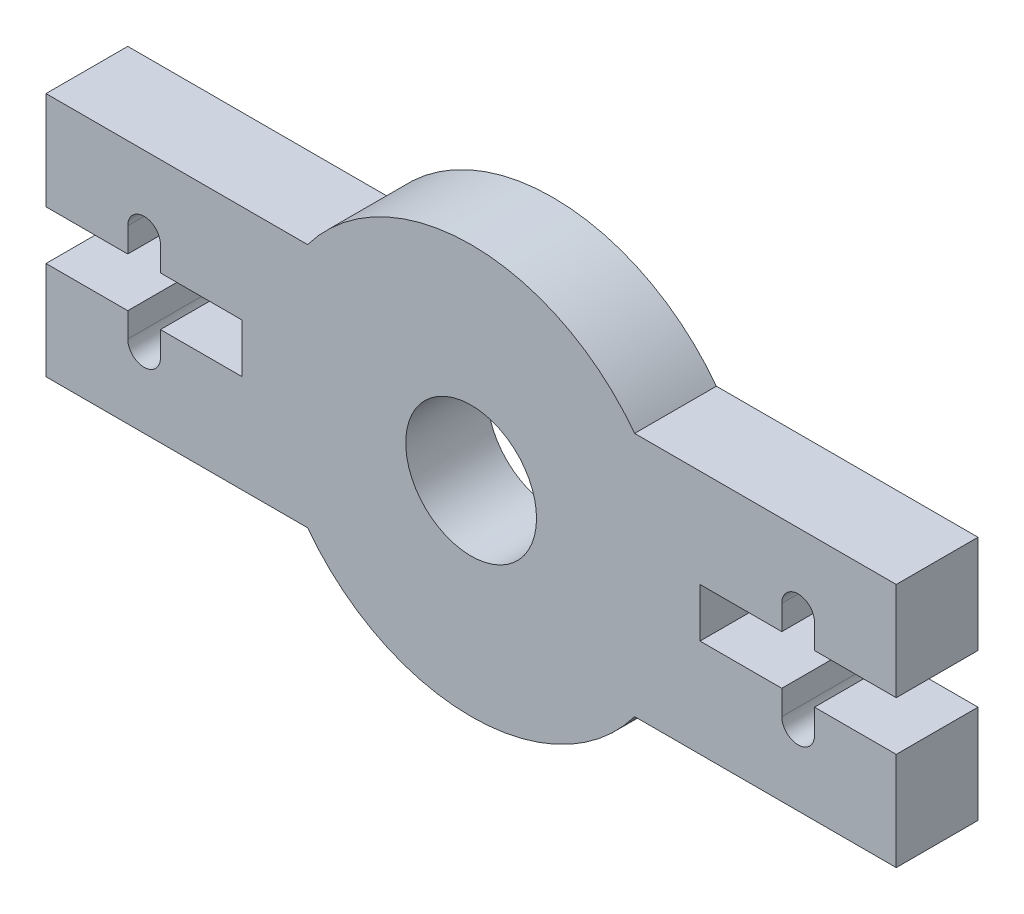
ISO-10303-21;
HEADER;
FILE_DESCRIPTION(('STEP AP214'),'2;1');
FILE_NAME('part.step','',(''),(''),'','','');
FILE_SCHEMA(('AUTOMOTIVE_DESIGN { 1 0 10303 214 1 1 1 1 }'));
ENDSEC;
DATA;
#1=APPLICATION_CONTEXT('core data for automotive mechanical design processes');
#2=APPLICATION_PROTOCOL_DEFINITION('international standard','automotive_design',2000,#1);
#3=PRODUCT_CONTEXT('',#1,'mechanical');
#4=PRODUCT('Part','Part','',(#3));
#5=PRODUCT_RELATED_PRODUCT_CATEGORY('part','',(#4));
#6=PRODUCT_DEFINITION_FORMATION('','',#4);
#7=PRODUCT_DEFINITION_CONTEXT('part definition',#1,'design');
#8=PRODUCT_DEFINITION('design','',#6,#7);
#9=PRODUCT_DEFINITION_SHAPE('','',#8);
#10=(LENGTH_UNIT() NAMED_UNIT(*) SI_UNIT(.MILLI.,.METRE.));
#11=(NAMED_UNIT(*) PLANE_ANGLE_UNIT() SI_UNIT($,.RADIAN.));
#12=(NAMED_UNIT(*) SI_UNIT($,.STERADIAN.) SOLID_ANGLE_UNIT());
#13=UNCERTAINTY_MEASURE_WITH_UNIT(LENGTH_MEASURE(1.E-05),#10,'distance_accuracy_value','');
#14=(GEOMETRIC_REPRESENTATION_CONTEXT(3) GLOBAL_UNCERTAINTY_ASSIGNED_CONTEXT((#13)) GLOBAL_UNIT_ASSIGNED_CONTEXT((#10,
#11,#12)) REPRESENTATION_CONTEXT('',''));
#15=CARTESIAN_POINT('',(0.,0.,0.));
#16=DIRECTION('',(0.,0.,1.));
#17=DIRECTION('',(1.,0.,0.));
#18=AXIS2_PLACEMENT_3D('',#15,#16,#17);
#19=CARTESIAN_POINT('',(0.,7.5,5.));
#20=DIRECTION('',(0.,-1.,0.));
#21=DIRECTION('',(0.,0.,-1.));
#22=AXIS2_PLACEMENT_3D('',#19,#20,#21);
#23=PLANE('',#22);
#24=DIRECTION('',(-1.,0.,0.));
#25=VECTOR('',#24,1.);
#26=CARTESIAN_POINT('',(0.,7.5,0.));
#27=LINE('',#26,#25);
#28=CARTESIAN_POINT('',(26.,7.49999999999999,0.));
#29=VERTEX_POINT('',#28);
#30=CARTESIAN_POINT('',(10.,7.5,0.));
#31=VERTEX_POINT('',#30);
#32=EDGE_CURVE('E341',#29,#31,#27,.T.);
#33=ORIENTED_EDGE('',*,*,#32,.T.);
#34=DIRECTION('',(0.,0.,-1.));
#35=VECTOR('',#34,1.);
#36=CARTESIAN_POINT('',(10.,7.5,5.));
#37=LINE('',#36,#35);
#38=CARTESIAN_POINT('',(10.,7.5,5.));
#39=VERTEX_POINT('',#38);
#40=EDGE_CURVE('E11',#39,#31,#37,.T.);
#41=ORIENTED_EDGE('',*,*,#40,.F.);
#42=DIRECTION('',(-1.,0.,0.));
#43=VECTOR('',#42,1.);
#44=CARTESIAN_POINT('',(0.,7.5,5.));
#45=LINE('',#44,#43);
#46=CARTESIAN_POINT('',(26.,7.49999999999999,5.));
#47=VERTEX_POINT('',#46);
#48=EDGE_CURVE('E334',#47,#39,#45,.T.);
#49=ORIENTED_EDGE('',*,*,#48,.F.);
#50=DIRECTION('',(0.,0.,-1.));
#51=VECTOR('',#50,1.);
#52=CARTESIAN_POINT('',(26.,7.49999999999999,5.));
#53=LINE('',#52,#51);
#54=EDGE_CURVE('E272',#47,#29,#53,.T.);
#55=ORIENTED_EDGE('',*,*,#54,.T.);
#56=EDGE_LOOP('',(#33,#41,#49,#55));
#57=FACE_BOUND('',#56,.T.);
#58=ADVANCED_FACE('F33',(#57),#23,.F.);
#59=CARTESIAN_POINT('',(0.,0.,5.));
#60=DIRECTION('',(0.,0.,-1.));
#61=DIRECTION('',(-1.,0.,0.));
#62=AXIS2_PLACEMENT_3D('',#59,#60,#61);
#63=CYLINDRICAL_SURFACE('',#62,12.5);
#64=CARTESIAN_POINT('',(0.,0.,0.));
#65=DIRECTION('',(0.,0.,1.));
#66=DIRECTION('',(1.,0.,0.));
#67=AXIS2_PLACEMENT_3D('',#64,#65,#66);
#68=CIRCLE('',#67,12.5);
#69=CARTESIAN_POINT('',(-10.,7.5,0.));
#70=VERTEX_POINT('',#69);
#71=EDGE_CURVE('E345',#31,#70,#68,.T.);
#72=ORIENTED_EDGE('',*,*,#71,.T.);
#73=DIRECTION('',(0.,0.,-1.));
#74=VECTOR('',#73,1.);
#75=CARTESIAN_POINT('',(-10.,7.5,5.));
#76=LINE('',#75,#74);
#77=CARTESIAN_POINT('',(-10.,7.5,5.));
#78=VERTEX_POINT('',#77);
#79=EDGE_CURVE('E41',#78,#70,#76,.T.);
#80=ORIENTED_EDGE('',*,*,#79,.F.);
#81=CARTESIAN_POINT('',(0.,0.,5.));
#82=DIRECTION('',(0.,0.,1.));
#83=DIRECTION('',(1.,0.,0.));
#84=AXIS2_PLACEMENT_3D('',#81,#82,#83);
#85=CIRCLE('',#84,12.5);
#86=EDGE_CURVE('E164',#39,#78,#85,.T.);
#87=ORIENTED_EDGE('',*,*,#86,.F.);
#88=ORIENTED_EDGE('',*,*,#40,.T.);
#89=EDGE_LOOP('',(#72,#80,#87,#88));
#90=FACE_BOUND('',#89,.T.);
#91=ADVANCED_FACE('F607',(#90),#63,.T.);
#92=CARTESIAN_POINT('',(0.,7.5,5.));
#93=DIRECTION('',(0.,-1.,0.));
#94=DIRECTION('',(0.,0.,-1.));
#95=AXIS2_PLACEMENT_3D('',#92,#93,#94);
#96=PLANE('',#95);
#97=DIRECTION('',(-1.,0.,0.));
#98=VECTOR('',#97,1.);
#99=CARTESIAN_POINT('',(0.,7.5,0.));
#100=LINE('',#99,#98);
#101=CARTESIAN_POINT('',(-26.,7.5,0.));
#102=VERTEX_POINT('',#101);
#103=EDGE_CURVE('E350',#70,#102,#100,.T.);
#104=ORIENTED_EDGE('',*,*,#103,.T.);
#105=DIRECTION('',(0.,0.,-1.));
#106=VECTOR('',#105,1.);
#107=CARTESIAN_POINT('',(-26.,7.5,5.));
#108=LINE('',#107,#106);
#109=CARTESIAN_POINT('',(-26.,7.5,5.));
#110=VERTEX_POINT('',#109);
#111=EDGE_CURVE('E471',#110,#102,#108,.T.);
#112=ORIENTED_EDGE('',*,*,#111,.F.);
#113=DIRECTION('',(-1.,0.,0.));
#114=VECTOR('',#113,1.);
#115=CARTESIAN_POINT('',(0.,7.5,5.));
#116=LINE('',#115,#114);
#117=EDGE_CURVE('E331',#78,#110,#116,.T.);
#118=ORIENTED_EDGE('',*,*,#117,.F.);
#119=ORIENTED_EDGE('',*,*,#79,.T.);
#120=EDGE_LOOP('',(#104,#112,#118,#119));
#121=FACE_BOUND('',#120,.T.);
#122=ADVANCED_FACE('F476',(#121),#96,.F.);
#123=CARTESIAN_POINT('',(-26.,-42.2370862161727,5.));
#124=DIRECTION('',(-1.,0.,0.));
#125=DIRECTION('',(0.,-1.,0.));
#126=AXIS2_PLACEMENT_3D('',#123,#124,#125);
#127=PLANE('',#126);
#128=DIRECTION('',(0.,1.,0.));
#129=VECTOR('',#128,1.);
#130=CARTESIAN_POINT('',(-26.,-42.2370862161727,0.));
#131=LINE('',#130,#129);
#132=CARTESIAN_POINT('',(-26.,1.5,0.));
#133=VERTEX_POINT('',#132);
#134=EDGE_CURVE('E355',#133,#102,#131,.T.);
#135=ORIENTED_EDGE('',*,*,#134,.F.);
#136=DIRECTION('',(0.,0.,-1.));
#137=VECTOR('',#136,1.);
#138=CARTESIAN_POINT('',(-26.,1.5,5.));
#139=LINE('',#138,#137);
#140=CARTESIAN_POINT('',(-26.,1.5,5.));
#141=VERTEX_POINT('',#140);
#142=EDGE_CURVE('E469',#141,#133,#139,.T.);
#143=ORIENTED_EDGE('',*,*,#142,.F.);
#144=DIRECTION('',(0.,1.,0.));
#145=VECTOR('',#144,1.);
#146=CARTESIAN_POINT('',(-26.,-42.2370862161727,5.));
#147=LINE('',#146,#145);
#148=EDGE_CURVE('E328',#141,#110,#147,.T.);
#149=ORIENTED_EDGE('',*,*,#148,.T.);
#150=ORIENTED_EDGE('',*,*,#111,.T.);
#151=EDGE_LOOP('',(#135,#143,#149,#150));
#152=FACE_BOUND('',#151,.T.);
#153=ADVANCED_FACE('F483',(#152),#127,.T.);
#154=CARTESIAN_POINT('',(0.,1.5,5.));
#155=DIRECTION('',(0.,-1.,0.));
#156=DIRECTION('',(0.,0.,-1.));
#157=AXIS2_PLACEMENT_3D('',#154,#155,#156);
#158=PLANE('',#157);
#159=DIRECTION('',(-1.,0.,0.));
#160=VECTOR('',#159,1.);
#161=CARTESIAN_POINT('',(0.,1.5,0.));
#162=LINE('',#161,#160);
#163=CARTESIAN_POINT('',(-21.,1.5,0.));
#164=VERTEX_POINT('',#163);
#165=EDGE_CURVE('E358',#164,#133,#162,.T.);
#166=ORIENTED_EDGE('',*,*,#165,.F.);
#167=DIRECTION('',(0.,0.,-1.));
#168=VECTOR('',#167,1.);
#169=CARTESIAN_POINT('',(-21.,1.5,5.));
#170=LINE('',#169,#168);
#171=CARTESIAN_POINT('',(-21.,1.5,5.));
#172=VERTEX_POINT('',#171);
#173=EDGE_CURVE('E467',#172,#164,#170,.T.);
#174=ORIENTED_EDGE('',*,*,#173,.F.);
#175=DIRECTION('',(-1.,0.,0.));
#176=VECTOR('',#175,1.);
#177=CARTESIAN_POINT('',(0.,1.5,5.));
#178=LINE('',#177,#176);
#179=EDGE_CURVE('E325',#172,#141,#178,.T.);
#180=ORIENTED_EDGE('',*,*,#179,.T.);
#181=ORIENTED_EDGE('',*,*,#142,.T.);
#182=EDGE_LOOP('',(#166,#174,#180,#181));
#183=FACE_BOUND('',#182,.T.);
#184=ADVANCED_FACE('F488',(#183),#158,.T.);
#185=CARTESIAN_POINT('',(-21.,-42.2370862161727,5.));
#186=DIRECTION('',(1.,0.,0.));
#187=DIRECTION('',(0.,0.,-1.));
#188=AXIS2_PLACEMENT_3D('',#185,#186,#187);
#189=PLANE('',#188);
#190=DIRECTION('',(0.,-1.,0.));
#191=VECTOR('',#190,1.);
#192=CARTESIAN_POINT('',(-21.,-42.2370862161727,0.));
#193=LINE('',#192,#191);
#194=CARTESIAN_POINT('',(-21.,3.,0.));
#195=VERTEX_POINT('',#194);
#196=EDGE_CURVE('E362',#195,#164,#193,.T.);
#197=ORIENTED_EDGE('',*,*,#196,.F.);
#198=DIRECTION('',(0.,0.,-1.));
#199=VECTOR('',#198,1.);
#200=CARTESIAN_POINT('',(-21.,3.,5.));
#201=LINE('',#200,#199);
#202=CARTESIAN_POINT('',(-21.,3.,5.));
#203=VERTEX_POINT('',#202);
#204=EDGE_CURVE('E465',#203,#195,#201,.T.);
#205=ORIENTED_EDGE('',*,*,#204,.F.);
#206=DIRECTION('',(0.,-1.,0.));
#207=VECTOR('',#206,1.);
#208=CARTESIAN_POINT('',(-21.,-42.2370862161727,5.));
#209=LINE('',#208,#207);
#210=EDGE_CURVE('E322',#203,#172,#209,.T.);
#211=ORIENTED_EDGE('',*,*,#210,.T.);
#212=ORIENTED_EDGE('',*,*,#173,.T.);
#213=EDGE_LOOP('',(#197,#205,#211,#212));
#214=FACE_BOUND('',#213,.T.);
#215=ADVANCED_FACE('F491',(#214),#189,.T.);
#216=CARTESIAN_POINT('',(-20.,3.,5.));
#217=DIRECTION('',(0.,0.,-1.));
#218=DIRECTION('',(-1.,0.,0.));
#219=AXIS2_PLACEMENT_3D('',#216,#217,#218);
#220=CYLINDRICAL_SURFACE('',#219,1.);
#221=CARTESIAN_POINT('',(-20.,3.,0.));
#222=DIRECTION('',(0.,0.,1.));
#223=DIRECTION('',(1.,0.,0.));
#224=AXIS2_PLACEMENT_3D('',#221,#222,#223);
#225=CIRCLE('',#224,1.);
#226=CARTESIAN_POINT('',(-19.,3.,0.));
#227=VERTEX_POINT('',#226);
#228=EDGE_CURVE('E366',#227,#195,#225,.T.);
#229=ORIENTED_EDGE('',*,*,#228,.F.);
#230=DIRECTION('',(0.,0.,-1.));
#231=VECTOR('',#230,1.);
#232=CARTESIAN_POINT('',(-19.,3.,5.));
#233=LINE('',#232,#231);
#234=CARTESIAN_POINT('',(-19.,3.,5.));
#235=VERTEX_POINT('',#234);
#236=EDGE_CURVE('E463',#235,#227,#233,.T.);
#237=ORIENTED_EDGE('',*,*,#236,.F.);
#238=CARTESIAN_POINT('',(-20.,3.,5.));
#239=DIRECTION('',(0.,0.,1.));
#240=DIRECTION('',(1.,0.,0.));
#241=AXIS2_PLACEMENT_3D('',#238,#239,#240);
#242=CIRCLE('',#241,1.);
#243=EDGE_CURVE('E319',#235,#203,#242,.T.);
#244=ORIENTED_EDGE('',*,*,#243,.T.);
#245=ORIENTED_EDGE('',*,*,#204,.T.);
#246=EDGE_LOOP('',(#229,#237,#244,#245));
#247=FACE_BOUND('',#246,.T.);
#248=ADVANCED_FACE('F495',(#247),#220,.F.);
#249=CARTESIAN_POINT('',(-19.,-42.2370862161727,5.));
#250=DIRECTION('',(1.,0.,0.));
#251=DIRECTION('',(0.,0.,-1.));
#252=AXIS2_PLACEMENT_3D('',#249,#250,#251);
#253=PLANE('',#252);
#254=DIRECTION('',(0.,-1.,0.));
#255=VECTOR('',#254,1.);
#256=CARTESIAN_POINT('',(-19.,-42.2370862161727,0.));
#257=LINE('',#256,#255);
#258=CARTESIAN_POINT('',(-19.,1.5,0.));
#259=VERTEX_POINT('',#258);
#260=EDGE_CURVE('E370',#227,#259,#257,.T.);
#261=ORIENTED_EDGE('',*,*,#260,.T.);
#262=DIRECTION('',(0.,0.,-1.));
#263=VECTOR('',#262,1.);
#264=CARTESIAN_POINT('',(-19.,1.5,5.));
#265=LINE('',#264,#263);
#266=CARTESIAN_POINT('',(-19.,1.5,5.));
#267=VERTEX_POINT('',#266);
#268=EDGE_CURVE('E461',#267,#259,#265,.T.);
#269=ORIENTED_EDGE('',*,*,#268,.F.);
#270=DIRECTION('',(0.,-1.,0.));
#271=VECTOR('',#270,1.);
#272=CARTESIAN_POINT('',(-19.,-42.2370862161727,5.));
#273=LINE('',#272,#271);
#274=EDGE_CURVE('E317',#235,#267,#273,.T.);
#275=ORIENTED_EDGE('',*,*,#274,.F.);
#276=ORIENTED_EDGE('',*,*,#236,.T.);
#277=EDGE_LOOP('',(#261,#269,#275,#276));
#278=FACE_BOUND('',#277,.T.);
#279=ADVANCED_FACE('F500',(#278),#253,.F.);
#280=CARTESIAN_POINT('',(-14.,1.5,0.));
#281=VERTEX_POINT('',#280);
#282=EDGE_CURVE('E363',#281,#259,#162,.T.);
#283=ORIENTED_EDGE('',*,*,#282,.F.);
#284=DIRECTION('',(0.,0.,-1.));
#285=VECTOR('',#284,1.);
#286=CARTESIAN_POINT('',(-14.,1.5,5.));
#287=LINE('',#286,#285);
#288=CARTESIAN_POINT('',(-14.,1.5,5.));
#289=VERTEX_POINT('',#288);
#290=EDGE_CURVE('E459',#289,#281,#287,.T.);
#291=ORIENTED_EDGE('',*,*,#290,.F.);
#292=EDGE_CURVE('E316',#289,#267,#178,.T.);
#293=ORIENTED_EDGE('',*,*,#292,.T.);
#294=ORIENTED_EDGE('',*,*,#268,.T.);
#295=EDGE_LOOP('',(#283,#291,#293,#294));
#296=FACE_BOUND('',#295,.T.);
#297=ADVANCED_FACE('F595',(#296),#158,.T.);
#298=CARTESIAN_POINT('',(-14.,-42.2370862161727,5.));
#299=DIRECTION('',(-1.,0.,0.));
#300=DIRECTION('',(0.,0.,1.));
#301=AXIS2_PLACEMENT_3D('',#298,#299,#300);
#302=PLANE('',#301);
#303=DIRECTION('',(0.,1.,0.));
#304=VECTOR('',#303,1.);
#305=CARTESIAN_POINT('',(-14.,-42.2370862161727,0.));
#306=LINE('',#305,#304);
#307=CARTESIAN_POINT('',(-14.,-1.5,0.));
#308=VERTEX_POINT('',#307);
#309=EDGE_CURVE('E374',#308,#281,#306,.T.);
#310=ORIENTED_EDGE('',*,*,#309,.F.);
#311=DIRECTION('',(0.,0.,-1.));
#312=VECTOR('',#311,1.);
#313=CARTESIAN_POINT('',(-14.,-1.5,5.));
#314=LINE('',#313,#312);
#315=CARTESIAN_POINT('',(-14.,-1.5,5.));
#316=VERTEX_POINT('',#315);
#317=EDGE_CURVE('E457',#316,#308,#314,.T.);
#318=ORIENTED_EDGE('',*,*,#317,.F.);
#319=DIRECTION('',(0.,1.,0.));
#320=VECTOR('',#319,1.);
#321=CARTESIAN_POINT('',(-14.,-42.2370862161727,5.));
#322=LINE('',#321,#320);
#323=EDGE_CURVE('E312',#316,#289,#322,.T.);
#324=ORIENTED_EDGE('',*,*,#323,.T.);
#325=ORIENTED_EDGE('',*,*,#290,.T.);
#326=EDGE_LOOP('',(#310,#318,#324,#325));
#327=FACE_BOUND('',#326,.T.);
#328=ADVANCED_FACE('F507',(#327),#302,.T.);
#329=CARTESIAN_POINT('',(0.,-1.5,5.));
#330=DIRECTION('',(0.,-1.,0.));
#331=DIRECTION('',(1.,0.,0.));
#332=AXIS2_PLACEMENT_3D('',#329,#330,#331);
#333=PLANE('',#332);
#334=DIRECTION('',(-1.,0.,0.));
#335=VECTOR('',#334,1.);
#336=CARTESIAN_POINT('',(0.,-1.5,0.));
#337=LINE('',#336,#335);
#338=CARTESIAN_POINT('',(-19.,-1.5,0.));
#339=VERTEX_POINT('',#338);
#340=EDGE_CURVE('E377',#308,#339,#337,.T.);
#341=ORIENTED_EDGE('',*,*,#340,.T.);
#342=DIRECTION('',(0.,0.,-1.));
#343=VECTOR('',#342,1.);
#344=CARTESIAN_POINT('',(-19.,-1.5,5.));
#345=LINE('',#344,#343);
#346=CARTESIAN_POINT('',(-19.,-1.5,5.));
#347=VERTEX_POINT('',#346);
#348=EDGE_CURVE('E454',#347,#339,#345,.T.);
#349=ORIENTED_EDGE('',*,*,#348,.F.);
#350=DIRECTION('',(-1.,0.,0.));
#351=VECTOR('',#350,1.);
#352=CARTESIAN_POINT('',(0.,-1.5,5.));
#353=LINE('',#352,#351);
#354=EDGE_CURVE('E310',#316,#347,#353,.T.);
#355=ORIENTED_EDGE('',*,*,#354,.F.);
#356=ORIENTED_EDGE('',*,*,#317,.T.);
#357=EDGE_LOOP('',(#341,#349,#355,#356));
#358=FACE_BOUND('',#357,.T.);
#359=ADVANCED_FACE('F513',(#358),#333,.F.);
#360=CARTESIAN_POINT('',(-19.,-3.,0.));
#361=VERTEX_POINT('',#360);
#362=EDGE_CURVE('E373',#339,#361,#257,.T.);
#363=ORIENTED_EDGE('',*,*,#362,.T.);
#364=DIRECTION('',(0.,0.,-1.));
#365=VECTOR('',#364,1.);
#366=CARTESIAN_POINT('',(-19.,-3.,5.));
#367=LINE('',#366,#365);
#368=CARTESIAN_POINT('',(-19.,-3.,5.));
#369=VERTEX_POINT('',#368);
#370=EDGE_CURVE('E452',#369,#361,#367,.T.);
#371=ORIENTED_EDGE('',*,*,#370,.F.);
#372=EDGE_CURVE('E309',#347,#369,#273,.T.);
#373=ORIENTED_EDGE('',*,*,#372,.F.);
#374=ORIENTED_EDGE('',*,*,#348,.T.);
#375=EDGE_LOOP('',(#363,#371,#373,#374));
#376=FACE_BOUND('',#375,.T.);
#377=ADVANCED_FACE('F521',(#376),#253,.F.);
#378=CARTESIAN_POINT('',(-20.,-3.,5.));
#379=DIRECTION('',(0.,0.,-1.));
#380=DIRECTION('',(-1.,0.,0.));
#381=AXIS2_PLACEMENT_3D('',#378,#379,#380);
#382=CYLINDRICAL_SURFACE('',#381,1.);
#383=CARTESIAN_POINT('',(-20.,-3.,0.));
#384=DIRECTION('',(0.,0.,1.));
#385=DIRECTION('',(1.,0.,0.));
#386=AXIS2_PLACEMENT_3D('',#383,#384,#385);
#387=CIRCLE('',#386,1.);
#388=CARTESIAN_POINT('',(-21.,-3.,0.));
#389=VERTEX_POINT('',#388);
#390=EDGE_CURVE('E380',#389,#361,#387,.T.);
#391=ORIENTED_EDGE('',*,*,#390,.F.);
#392=DIRECTION('',(0.,0.,-1.));
#393=VECTOR('',#392,1.);
#394=CARTESIAN_POINT('',(-21.,-3.,5.));
#395=LINE('',#394,#393);
#396=CARTESIAN_POINT('',(-21.,-3.,5.));
#397=VERTEX_POINT('',#396);
#398=EDGE_CURVE('E450',#397,#389,#395,.T.);
#399=ORIENTED_EDGE('',*,*,#398,.F.);
#400=CARTESIAN_POINT('',(-20.,-3.,5.));
#401=DIRECTION('',(0.,0.,1.));
#402=DIRECTION('',(1.,0.,0.));
#403=AXIS2_PLACEMENT_3D('',#400,#401,#402);
#404=CIRCLE('',#403,1.);
#405=EDGE_CURVE('E305',#397,#369,#404,.T.);
#406=ORIENTED_EDGE('',*,*,#405,.T.);
#407=ORIENTED_EDGE('',*,*,#370,.T.);
#408=EDGE_LOOP('',(#391,#399,#406,#407));
#409=FACE_BOUND('',#408,.T.);
#410=ADVANCED_FACE('F525',(#409),#382,.F.);
#411=CARTESIAN_POINT('',(-21.,-1.5,0.));
#412=VERTEX_POINT('',#411);
#413=EDGE_CURVE('E367',#412,#389,#193,.T.);
#414=ORIENTED_EDGE('',*,*,#413,.F.);
#415=DIRECTION('',(0.,0.,-1.));
#416=VECTOR('',#415,1.);
#417=CARTESIAN_POINT('',(-21.,-1.5,5.));
#418=LINE('',#417,#416);
#419=CARTESIAN_POINT('',(-21.,-1.5,5.));
#420=VERTEX_POINT('',#419);
#421=EDGE_CURVE('E448',#420,#412,#418,.T.);
#422=ORIENTED_EDGE('',*,*,#421,.F.);
#423=EDGE_CURVE('E308',#420,#397,#209,.T.);
#424=ORIENTED_EDGE('',*,*,#423,.T.);
#425=ORIENTED_EDGE('',*,*,#398,.T.);
#426=EDGE_LOOP('',(#414,#422,#424,#425));
#427=FACE_BOUND('',#426,.T.);
#428=ADVANCED_FACE('F529',(#427),#189,.T.);
#429=CARTESIAN_POINT('',(-26.,-1.5,0.));
#430=VERTEX_POINT('',#429);
#431=EDGE_CURVE('E379',#412,#430,#337,.T.);
#432=ORIENTED_EDGE('',*,*,#431,.T.);
#433=DIRECTION('',(0.,0.,-1.));
#434=VECTOR('',#433,1.);
#435=CARTESIAN_POINT('',(-26.,-1.5,5.));
#436=LINE('',#435,#434);
#437=CARTESIAN_POINT('',(-26.,-1.5,5.));
#438=VERTEX_POINT('',#437);
#439=EDGE_CURVE('E446',#438,#430,#436,.T.);
#440=ORIENTED_EDGE('',*,*,#439,.F.);
#441=EDGE_CURVE('E313',#420,#438,#353,.T.);
#442=ORIENTED_EDGE('',*,*,#441,.F.);
#443=ORIENTED_EDGE('',*,*,#421,.T.);
#444=EDGE_LOOP('',(#432,#440,#442,#443));
#445=FACE_BOUND('',#444,.T.);
#446=ADVANCED_FACE('F625',(#445),#333,.F.);
#447=CARTESIAN_POINT('',(-26.,-7.5,0.));
#448=VERTEX_POINT('',#447);
#449=EDGE_CURVE('E359',#448,#430,#131,.T.);
#450=ORIENTED_EDGE('',*,*,#449,.F.);
#451=DIRECTION('',(0.,0.,-1.));
#452=VECTOR('',#451,1.);
#453=CARTESIAN_POINT('',(-26.,-7.5,5.));
#454=LINE('',#453,#452);
#455=CARTESIAN_POINT('',(-26.,-7.5,5.));
#456=VERTEX_POINT('',#455);
#457=EDGE_CURVE('E444',#456,#448,#454,.T.);
#458=ORIENTED_EDGE('',*,*,#457,.F.);
#459=EDGE_CURVE('E304',#456,#438,#147,.T.);
#460=ORIENTED_EDGE('',*,*,#459,.T.);
#461=ORIENTED_EDGE('',*,*,#439,.T.);
#462=EDGE_LOOP('',(#450,#458,#460,#461));
#463=FACE_BOUND('',#462,.T.);
#464=ADVANCED_FACE('F536',(#463),#127,.T.);
#465=CARTESIAN_POINT('',(0.,-7.5,5.));
#466=DIRECTION('',(0.,-1.,0.));
#467=DIRECTION('',(0.,0.,-1.));
#468=AXIS2_PLACEMENT_3D('',#465,#466,#467);
#469=PLANE('',#468);
#470=DIRECTION('',(-1.,0.,0.));
#471=VECTOR('',#470,1.);
#472=CARTESIAN_POINT('',(0.,-7.5,0.));
#473=LINE('',#472,#471);
#474=CARTESIAN_POINT('',(-10.,-7.5,0.));
#475=VERTEX_POINT('',#474);
#476=EDGE_CURVE('E383',#475,#448,#473,.T.);
#477=ORIENTED_EDGE('',*,*,#476,.F.);
#478=DIRECTION('',(0.,0.,-1.));
#479=VECTOR('',#478,1.);
#480=CARTESIAN_POINT('',(-10.,-7.5,5.));
#481=LINE('',#480,#479);
#482=CARTESIAN_POINT('',(-10.,-7.5,5.));
#483=VERTEX_POINT('',#482);
#484=EDGE_CURVE('E442',#483,#475,#481,.T.);
#485=ORIENTED_EDGE('',*,*,#484,.F.);
#486=DIRECTION('',(-1.,0.,0.));
#487=VECTOR('',#486,1.);
#488=CARTESIAN_POINT('',(0.,-7.5,5.));
#489=LINE('',#488,#487);
#490=EDGE_CURVE('E301',#483,#456,#489,.T.);
#491=ORIENTED_EDGE('',*,*,#490,.T.);
#492=ORIENTED_EDGE('',*,*,#457,.T.);
#493=EDGE_LOOP('',(#477,#485,#491,#492));
#494=FACE_BOUND('',#493,.T.);
#495=ADVANCED_FACE('F541',(#494),#469,.T.);
#496=CARTESIAN_POINT('',(0.,0.,5.));
#497=DIRECTION('',(0.,0.,-1.));
#498=DIRECTION('',(-1.,0.,0.));
#499=AXIS2_PLACEMENT_3D('',#496,#497,#498);
#500=CYLINDRICAL_SURFACE('',#499,12.5);
#501=CARTESIAN_POINT('',(0.,0.,0.));
#502=DIRECTION('',(0.,0.,1.));
#503=DIRECTION('',(1.,0.,0.));
#504=AXIS2_PLACEMENT_3D('',#501,#502,#503);
#505=CIRCLE('',#504,12.5);
#506=CARTESIAN_POINT('',(10.,-7.5,0.));
#507=VERTEX_POINT('',#506);
#508=EDGE_CURVE('E386',#475,#507,#505,.T.);
#509=ORIENTED_EDGE('',*,*,#508,.T.);
#510=DIRECTION('',(0.,0.,-1.));
#511=VECTOR('',#510,1.);
#512=CARTESIAN_POINT('',(10.,-7.5,5.));
#513=LINE('',#512,#511);
#514=CARTESIAN_POINT('',(10.,-7.5,5.));
#515=VERTEX_POINT('',#514);
#516=EDGE_CURVE('E440',#515,#507,#513,.T.);
#517=ORIENTED_EDGE('',*,*,#516,.F.);
#518=CARTESIAN_POINT('',(0.,0.,5.));
#519=DIRECTION('',(0.,0.,1.));
#520=DIRECTION('',(1.,0.,0.));
#521=AXIS2_PLACEMENT_3D('',#518,#519,#520);
#522=CIRCLE('',#521,12.5);
#523=EDGE_CURVE('E299',#483,#515,#522,.T.);
#524=ORIENTED_EDGE('',*,*,#523,.F.);
#525=ORIENTED_EDGE('',*,*,#484,.T.);
#526=EDGE_LOOP('',(#509,#517,#524,#525));
#527=FACE_BOUND('',#526,.T.);
#528=ADVANCED_FACE('F546',(#527),#500,.T.);
#529=CARTESIAN_POINT('',(0.,-7.5,5.));
#530=DIRECTION('',(0.,-1.,0.));
#531=DIRECTION('',(0.,0.,-1.));
#532=AXIS2_PLACEMENT_3D('',#529,#530,#531);
#533=PLANE('',#532);
#534=DIRECTION('',(-1.,0.,0.));
#535=VECTOR('',#534,1.);
#536=CARTESIAN_POINT('',(0.,-7.5,0.));
#537=LINE('',#536,#535);
#538=CARTESIAN_POINT('',(26.,-7.5,0.));
#539=VERTEX_POINT('',#538);
#540=EDGE_CURVE('E389',#539,#507,#537,.T.);
#541=ORIENTED_EDGE('',*,*,#540,.F.);
#542=DIRECTION('',(0.,0.,-1.));
#543=VECTOR('',#542,1.);
#544=CARTESIAN_POINT('',(26.,-7.5,5.));
#545=LINE('',#544,#543);
#546=CARTESIAN_POINT('',(26.,-7.5,5.));
#547=VERTEX_POINT('',#546);
#548=EDGE_CURVE('E438',#547,#539,#545,.T.);
#549=ORIENTED_EDGE('',*,*,#548,.F.);
#550=DIRECTION('',(-1.,0.,0.));
#551=VECTOR('',#550,1.);
#552=CARTESIAN_POINT('',(0.,-7.5,5.));
#553=LINE('',#552,#551);
#554=EDGE_CURVE('E296',#547,#515,#553,.T.);
#555=ORIENTED_EDGE('',*,*,#554,.T.);
#556=ORIENTED_EDGE('',*,*,#516,.T.);
#557=EDGE_LOOP('',(#541,#549,#555,#556));
#558=FACE_BOUND('',#557,.T.);
#559=ADVANCED_FACE('F553',(#558),#533,.T.);
#560=CARTESIAN_POINT('',(26.,-42.2370862161727,5.));
#561=DIRECTION('',(-1.,0.,0.));
#562=DIRECTION('',(0.,-1.,0.));
#563=AXIS2_PLACEMENT_3D('',#560,#561,#562);
#564=PLANE('',#563);
#565=DIRECTION('',(0.,1.,0.));
#566=VECTOR('',#565,1.);
#567=CARTESIAN_POINT('',(26.,-42.2370862161727,0.));
#568=LINE('',#567,#566);
#569=CARTESIAN_POINT('',(26.,-1.5,0.));
#570=VERTEX_POINT('',#569);
#571=EDGE_CURVE('E392',#539,#570,#568,.T.);
#572=ORIENTED_EDGE('',*,*,#571,.T.);
#573=DIRECTION('',(0.,0.,-1.));
#574=VECTOR('',#573,1.);
#575=CARTESIAN_POINT('',(26.,-1.5,5.));
#576=LINE('',#575,#574);
#577=CARTESIAN_POINT('',(26.,-1.5,5.));
#578=VERTEX_POINT('',#577);
#579=EDGE_CURVE('E436',#578,#570,#576,.T.);
#580=ORIENTED_EDGE('',*,*,#579,.F.);
#581=DIRECTION('',(0.,1.,0.));
#582=VECTOR('',#581,1.);
#583=CARTESIAN_POINT('',(26.,-42.2370862161727,5.));
#584=LINE('',#583,#582);
#585=EDGE_CURVE('E274',#547,#578,#584,.T.);
#586=ORIENTED_EDGE('',*,*,#585,.F.);
#587=ORIENTED_EDGE('',*,*,#548,.T.);
#588=EDGE_LOOP('',(#572,#580,#586,#587));
#589=FACE_BOUND('',#588,.T.);
#590=ADVANCED_FACE('F556',(#589),#564,.F.);
#591=CARTESIAN_POINT('',(0.,-1.5,5.));
#592=DIRECTION('',(0.,1.,0.));
#593=DIRECTION('',(-1.,0.,0.));
#594=AXIS2_PLACEMENT_3D('',#591,#592,#593);
#595=PLANE('',#594);
#596=DIRECTION('',(1.,0.,0.));
#597=VECTOR('',#596,1.);
#598=CARTESIAN_POINT('',(0.,-1.5,0.));
#599=LINE('',#598,#597);
#600=CARTESIAN_POINT('',(21.,-1.5,0.));
#601=VERTEX_POINT('',#600);
#602=EDGE_CURVE('E395',#601,#570,#599,.T.);
#603=ORIENTED_EDGE('',*,*,#602,.F.);
#604=DIRECTION('',(0.,0.,-1.));
#605=VECTOR('',#604,1.);
#606=CARTESIAN_POINT('',(21.,-1.5,5.));
#607=LINE('',#606,#605);
#608=CARTESIAN_POINT('',(21.,-1.5,5.));
#609=VERTEX_POINT('',#608);
#610=EDGE_CURVE('E434',#609,#601,#607,.T.);
#611=ORIENTED_EDGE('',*,*,#610,.F.);
#612=DIRECTION('',(1.,0.,0.));
#613=VECTOR('',#612,1.);
#614=CARTESIAN_POINT('',(0.,-1.5,5.));
#615=LINE('',#614,#613);
#616=EDGE_CURVE('E290',#609,#578,#615,.T.);
#617=ORIENTED_EDGE('',*,*,#616,.T.);
#618=ORIENTED_EDGE('',*,*,#579,.T.);
#619=EDGE_LOOP('',(#603,#611,#617,#618));
#620=FACE_BOUND('',#619,.T.);
#621=ADVANCED_FACE('F559',(#620),#595,.T.);
#622=CARTESIAN_POINT('',(21.,-42.2370862161727,5.));
#623=DIRECTION('',(1.,0.,0.));
#624=DIRECTION('',(0.,0.,-1.));
#625=AXIS2_PLACEMENT_3D('',#622,#623,#624);
#626=PLANE('',#625);
#627=DIRECTION('',(0.,-1.,0.));
#628=VECTOR('',#627,1.);
#629=CARTESIAN_POINT('',(21.,-42.2370862161727,0.));
#630=LINE('',#629,#628);
#631=CARTESIAN_POINT('',(21.,-3.,0.));
#632=VERTEX_POINT('',#631);
#633=EDGE_CURVE('E398',#601,#632,#630,.T.);
#634=ORIENTED_EDGE('',*,*,#633,.T.);
#635=DIRECTION('',(0.,0.,-1.));
#636=VECTOR('',#635,1.);
#637=CARTESIAN_POINT('',(21.,-3.,5.));
#638=LINE('',#637,#636);
#639=CARTESIAN_POINT('',(21.,-3.,5.));
#640=VERTEX_POINT('',#639);
#641=EDGE_CURVE('E431',#640,#632,#638,.T.);
#642=ORIENTED_EDGE('',*,*,#641,.F.);
#643=DIRECTION('',(0.,-1.,0.));
#644=VECTOR('',#643,1.);
#645=CARTESIAN_POINT('',(21.,-42.2370862161727,5.));
#646=LINE('',#645,#644);
#647=EDGE_CURVE('E261',#609,#640,#646,.T.);
#648=ORIENTED_EDGE('',*,*,#647,.F.);
#649=ORIENTED_EDGE('',*,*,#610,.T.);
#650=EDGE_LOOP('',(#634,#642,#648,#649));
#651=FACE_BOUND('',#650,.T.);
#652=ADVANCED_FACE('F566',(#651),#626,.F.);
#653=CARTESIAN_POINT('',(20.,-3.,5.));
#654=DIRECTION('',(0.,0.,-1.));
#655=DIRECTION('',(-1.,0.,0.));
#656=AXIS2_PLACEMENT_3D('',#653,#654,#655);
#657=CYLINDRICAL_SURFACE('',#656,1.);
#658=CARTESIAN_POINT('',(20.,-3.,0.));
#659=DIRECTION('',(0.,0.,1.));
#660=DIRECTION('',(1.,0.,0.));
#661=AXIS2_PLACEMENT_3D('',#658,#659,#660);
#662=CIRCLE('',#661,1.);
#663=CARTESIAN_POINT('',(19.,-3.,0.));
#664=VERTEX_POINT('',#663);
#665=EDGE_CURVE('E401',#632,#664,#662,.F.);
#666=ORIENTED_EDGE('',*,*,#665,.T.);
#667=DIRECTION('',(0.,0.,-1.));
#668=VECTOR('',#667,1.);
#669=CARTESIAN_POINT('',(19.,-3.,5.));
#670=LINE('',#669,#668);
#671=CARTESIAN_POINT('',(19.,-3.,5.));
#672=VERTEX_POINT('',#671);
#673=EDGE_CURVE('E429',#672,#664,#670,.T.);
#674=ORIENTED_EDGE('',*,*,#673,.F.);
#675=CARTESIAN_POINT('',(20.,-3.,5.));
#676=DIRECTION('',(0.,0.,1.));
#677=DIRECTION('',(1.,0.,0.));
#678=AXIS2_PLACEMENT_3D('',#675,#676,#677);
#679=CIRCLE('',#678,1.);
#680=EDGE_CURVE('E293',#640,#672,#679,.F.);
#681=ORIENTED_EDGE('',*,*,#680,.F.);
#682=ORIENTED_EDGE('',*,*,#641,.T.);
#683=EDGE_LOOP('',(#666,#674,#681,#682));
#684=FACE_BOUND('',#683,.T.);
#685=ADVANCED_FACE('F570',(#684),#657,.F.);
#686=CARTESIAN_POINT('',(19.,-42.2370862161727,5.));
#687=DIRECTION('',(1.,0.,0.));
#688=DIRECTION('',(0.,0.,-1.));
#689=AXIS2_PLACEMENT_3D('',#686,#687,#688);
#690=PLANE('',#689);
#691=DIRECTION('',(0.,-1.,0.));
#692=VECTOR('',#691,1.);
#693=CARTESIAN_POINT('',(19.,-42.2370862161727,0.));
#694=LINE('',#693,#692);
#695=CARTESIAN_POINT('',(19.,-1.5,0.));
#696=VERTEX_POINT('',#695);
#697=EDGE_CURVE('E404',#696,#664,#694,.T.);
#698=ORIENTED_EDGE('',*,*,#697,.F.);
#699=DIRECTION('',(0.,0.,-1.));
#700=VECTOR('',#699,1.);
#701=CARTESIAN_POINT('',(19.,-1.5,5.));
#702=LINE('',#701,#700);
#703=CARTESIAN_POINT('',(19.,-1.5,5.));
#704=VERTEX_POINT('',#703);
#705=EDGE_CURVE('E427',#704,#696,#702,.T.);
#706=ORIENTED_EDGE('',*,*,#705,.F.);
#707=DIRECTION('',(0.,-1.,0.));
#708=VECTOR('',#707,1.);
#709=CARTESIAN_POINT('',(19.,-42.2370862161727,5.));
#710=LINE('',#709,#708);
#711=EDGE_CURVE('E283',#704,#672,#710,.T.);
#712=ORIENTED_EDGE('',*,*,#711,.T.);
#713=ORIENTED_EDGE('',*,*,#673,.T.);
#714=EDGE_LOOP('',(#698,#706,#712,#713));
#715=FACE_BOUND('',#714,.T.);
#716=ADVANCED_FACE('F573',(#715),#690,.T.);
#717=CARTESIAN_POINT('',(14.,-1.5,0.));
#718=VERTEX_POINT('',#717);
#719=EDGE_CURVE('E399',#718,#696,#599,.T.);
#720=ORIENTED_EDGE('',*,*,#719,.F.);
#721=DIRECTION('',(0.,0.,-1.));
#722=VECTOR('',#721,1.);
#723=CARTESIAN_POINT('',(14.,-1.5,5.));
#724=LINE('',#723,#722);
#725=CARTESIAN_POINT('',(14.,-1.5,5.));
#726=VERTEX_POINT('',#725);
#727=EDGE_CURVE('E425',#726,#718,#724,.T.);
#728=ORIENTED_EDGE('',*,*,#727,.F.);
#729=EDGE_CURVE('E284',#726,#704,#615,.T.);
#730=ORIENTED_EDGE('',*,*,#729,.T.);
#731=ORIENTED_EDGE('',*,*,#705,.T.);
#732=EDGE_LOOP('',(#720,#728,#730,#731));
#733=FACE_BOUND('',#732,.T.);
#734=ADVANCED_FACE('F576',(#733),#595,.T.);
#735=CARTESIAN_POINT('',(14.,-42.2370862161727,5.));
#736=DIRECTION('',(-1.,0.,0.));
#737=DIRECTION('',(0.,0.,1.));
#738=AXIS2_PLACEMENT_3D('',#735,#736,#737);
#739=PLANE('',#738);
#740=DIRECTION('',(0.,1.,0.));
#741=VECTOR('',#740,1.);
#742=CARTESIAN_POINT('',(14.,-42.2370862161727,0.));
#743=LINE('',#742,#741);
#744=CARTESIAN_POINT('',(14.,1.5,0.));
#745=VERTEX_POINT('',#744);
#746=EDGE_CURVE('E408',#718,#745,#743,.T.);
#747=ORIENTED_EDGE('',*,*,#746,.T.);
#748=DIRECTION('',(0.,0.,-1.));
#749=VECTOR('',#748,1.);
#750=CARTESIAN_POINT('',(14.,1.5,5.));
#751=LINE('',#750,#749);
#752=CARTESIAN_POINT('',(14.,1.5,5.));
#753=VERTEX_POINT('',#752);
#754=EDGE_CURVE('E422',#753,#745,#751,.T.);
#755=ORIENTED_EDGE('',*,*,#754,.F.);
#756=DIRECTION('',(0.,1.,0.));
#757=VECTOR('',#756,1.);
#758=CARTESIAN_POINT('',(14.,-42.2370862161727,5.));
#759=LINE('',#758,#757);
#760=EDGE_CURVE('E278',#726,#753,#759,.T.);
#761=ORIENTED_EDGE('',*,*,#760,.F.);
#762=ORIENTED_EDGE('',*,*,#727,.T.);
#763=EDGE_LOOP('',(#747,#755,#761,#762));
#764=FACE_BOUND('',#763,.T.);
#765=ADVANCED_FACE('F580',(#764),#739,.F.);
#766=CARTESIAN_POINT('',(0.,1.5,5.));
#767=DIRECTION('',(0.,1.,0.));
#768=DIRECTION('',(0.,0.,1.));
#769=AXIS2_PLACEMENT_3D('',#766,#767,#768);
#770=PLANE('',#769);
#771=DIRECTION('',(1.,0.,0.));
#772=VECTOR('',#771,1.);
#773=CARTESIAN_POINT('',(0.,1.5,0.));
#774=LINE('',#773,#772);
#775=CARTESIAN_POINT('',(19.,1.5,0.));
#776=VERTEX_POINT('',#775);
#777=EDGE_CURVE('E410',#745,#776,#774,.T.);
#778=ORIENTED_EDGE('',*,*,#777,.T.);
#779=DIRECTION('',(0.,0.,-1.));
#780=VECTOR('',#779,1.);
#781=CARTESIAN_POINT('',(19.,1.5,5.));
#782=LINE('',#781,#780);
#783=CARTESIAN_POINT('',(19.,1.5,5.));
#784=VERTEX_POINT('',#783);
#785=EDGE_CURVE('E420',#784,#776,#782,.T.);
#786=ORIENTED_EDGE('',*,*,#785,.F.);
#787=DIRECTION('',(1.,0.,0.));
#788=VECTOR('',#787,1.);
#789=CARTESIAN_POINT('',(0.,1.5,5.));
#790=LINE('',#789,#788);
#791=EDGE_CURVE('E271',#753,#784,#790,.T.);
#792=ORIENTED_EDGE('',*,*,#791,.F.);
#793=ORIENTED_EDGE('',*,*,#754,.T.);
#794=EDGE_LOOP('',(#778,#786,#792,#793));
#795=FACE_BOUND('',#794,.T.);
#796=ADVANCED_FACE('F583',(#795),#770,.F.);
#797=CARTESIAN_POINT('',(19.,3.,0.));
#798=VERTEX_POINT('',#797);
#799=EDGE_CURVE('E407',#798,#776,#694,.T.);
#800=ORIENTED_EDGE('',*,*,#799,.F.);
#801=DIRECTION('',(0.,0.,-1.));
#802=VECTOR('',#801,1.);
#803=CARTESIAN_POINT('',(19.,3.,5.));
#804=LINE('',#803,#802);
#805=CARTESIAN_POINT('',(19.,3.,5.));
#806=VERTEX_POINT('',#805);
#807=EDGE_CURVE('E418',#806,#798,#804,.T.);
#808=ORIENTED_EDGE('',*,*,#807,.F.);
#809=EDGE_CURVE('E277',#806,#784,#710,.T.);
#810=ORIENTED_EDGE('',*,*,#809,.T.);
#811=ORIENTED_EDGE('',*,*,#785,.T.);
#812=EDGE_LOOP('',(#800,#808,#810,#811));
#813=FACE_BOUND('',#812,.T.);
#814=ADVANCED_FACE('F587',(#813),#690,.T.);
#815=CARTESIAN_POINT('',(20.,3.,5.));
#816=DIRECTION('',(0.,0.,-1.));
#817=DIRECTION('',(-1.,0.,0.));
#818=AXIS2_PLACEMENT_3D('',#815,#816,#817);
#819=CYLINDRICAL_SURFACE('',#818,1.);
#820=CARTESIAN_POINT('',(20.,3.,0.));
#821=DIRECTION('',(0.,0.,1.));
#822=DIRECTION('',(1.,0.,0.));
#823=AXIS2_PLACEMENT_3D('',#820,#821,#822);
#824=CIRCLE('',#823,1.);
#825=CARTESIAN_POINT('',(21.,3.,0.));
#826=VERTEX_POINT('',#825);
#827=EDGE_CURVE('E413',#798,#826,#824,.F.);
#828=ORIENTED_EDGE('',*,*,#827,.T.);
#829=DIRECTION('',(0.,0.,-1.));
#830=VECTOR('',#829,1.);
#831=CARTESIAN_POINT('',(21.,3.,5.));
#832=LINE('',#831,#830);
#833=CARTESIAN_POINT('',(21.,3.,5.));
#834=VERTEX_POINT('',#833);
#835=EDGE_CURVE('E266',#834,#826,#832,.T.);
#836=ORIENTED_EDGE('',*,*,#835,.F.);
#837=CARTESIAN_POINT('',(20.,3.,5.));
#838=DIRECTION('',(0.,0.,1.));
#839=DIRECTION('',(1.,0.,0.));
#840=AXIS2_PLACEMENT_3D('',#837,#838,#839);
#841=CIRCLE('',#840,1.);
#842=EDGE_CURVE('E256',#806,#834,#841,.F.);
#843=ORIENTED_EDGE('',*,*,#842,.F.);
#844=ORIENTED_EDGE('',*,*,#807,.T.);
#845=EDGE_LOOP('',(#828,#836,#843,#844));
#846=FACE_BOUND('',#845,.T.);
#847=ADVANCED_FACE('F590',(#846),#819,.F.);
#848=CARTESIAN_POINT('',(21.,1.5,0.));
#849=VERTEX_POINT('',#848);
#850=EDGE_CURVE('E265',#826,#849,#630,.T.);
#851=ORIENTED_EDGE('',*,*,#850,.T.);
#852=DIRECTION('',(0.,0.,-1.));
#853=VECTOR('',#852,1.);
#854=CARTESIAN_POINT('',(21.,1.5,5.));
#855=LINE('',#854,#853);
#856=CARTESIAN_POINT('',(21.,1.5,5.));
#857=VERTEX_POINT('',#856);
#858=EDGE_CURVE('E262',#857,#849,#855,.T.);
#859=ORIENTED_EDGE('',*,*,#858,.F.);
#860=EDGE_CURVE('E249',#834,#857,#646,.T.);
#861=ORIENTED_EDGE('',*,*,#860,.F.);
#862=ORIENTED_EDGE('',*,*,#835,.T.);
#863=EDGE_LOOP('',(#851,#859,#861,#862));
#864=FACE_BOUND('',#863,.T.);
#865=ADVANCED_FACE('F263',(#864),#626,.F.);
#866=CARTESIAN_POINT('',(26.,1.5,0.));
#867=VERTEX_POINT('',#866);
#868=EDGE_CURVE('E150',#849,#867,#774,.T.);
#869=ORIENTED_EDGE('',*,*,#868,.T.);
#870=DIRECTION('',(0.,0.,-1.));
#871=VECTOR('',#870,1.);
#872=CARTESIAN_POINT('',(26.,1.5,5.));
#873=LINE('',#872,#871);
#874=CARTESIAN_POINT('',(26.,1.5,5.));
#875=VERTEX_POINT('',#874);
#876=EDGE_CURVE('E267',#875,#867,#873,.T.);
#877=ORIENTED_EDGE('',*,*,#876,.F.);
#878=EDGE_CURVE('E253',#857,#875,#790,.T.);
#879=ORIENTED_EDGE('',*,*,#878,.F.);
#880=ORIENTED_EDGE('',*,*,#858,.T.);
#881=EDGE_LOOP('',(#869,#877,#879,#880));
#882=FACE_BOUND('',#881,.T.);
#883=ADVANCED_FACE('F269',(#882),#770,.F.);
#884=EDGE_CURVE('E156',#867,#29,#568,.T.);
#885=ORIENTED_EDGE('',*,*,#884,.T.);
#886=ORIENTED_EDGE('',*,*,#54,.F.);
#887=EDGE_CURVE('E49',#875,#47,#584,.T.);
#888=ORIENTED_EDGE('',*,*,#887,.F.);
#889=ORIENTED_EDGE('',*,*,#876,.T.);
#890=EDGE_LOOP('',(#885,#886,#888,#889));
#891=FACE_BOUND('',#890,.T.);
#892=ADVANCED_FACE('F661',(#891),#564,.F.);
#893=CARTESIAN_POINT('',(0.,-42.2370862161727,5.));
#894=DIRECTION('',(0.,0.,1.));
#895=DIRECTION('',(1.,0.,0.));
#896=AXIS2_PLACEMENT_3D('',#893,#894,#895);
#897=PLANE('',#896);
#898=CARTESIAN_POINT('',(0.,0.,5.));
#899=DIRECTION('',(0.,0.,1.));
#900=DIRECTION('',(1.,0.,0.));
#901=AXIS2_PLACEMENT_3D('',#898,#899,#900);
#902=CIRCLE('',#901,4.);
#903=CARTESIAN_POINT('',(4.,0.,5.));
#904=VERTEX_POINT('',#903);
#905=EDGE_CURVE('E336',#904,#904,#902,.T.);
#906=ORIENTED_EDGE('',*,*,#905,.F.);
#907=EDGE_LOOP('',(#906));
#908=FACE_BOUND('',#907,.T.);
#909=ORIENTED_EDGE('',*,*,#48,.T.);
#910=ORIENTED_EDGE('',*,*,#86,.T.);
#911=ORIENTED_EDGE('',*,*,#117,.T.);
#912=ORIENTED_EDGE('',*,*,#148,.F.);
#913=ORIENTED_EDGE('',*,*,#179,.F.);
#914=ORIENTED_EDGE('',*,*,#210,.F.);
#915=ORIENTED_EDGE('',*,*,#243,.F.);
#916=ORIENTED_EDGE('',*,*,#274,.T.);
#917=ORIENTED_EDGE('',*,*,#292,.F.);
#918=ORIENTED_EDGE('',*,*,#323,.F.);
#919=ORIENTED_EDGE('',*,*,#354,.T.);
#920=ORIENTED_EDGE('',*,*,#372,.T.);
#921=ORIENTED_EDGE('',*,*,#405,.F.);
#922=ORIENTED_EDGE('',*,*,#423,.F.);
#923=ORIENTED_EDGE('',*,*,#441,.T.);
#924=ORIENTED_EDGE('',*,*,#459,.F.);
#925=ORIENTED_EDGE('',*,*,#490,.F.);
#926=ORIENTED_EDGE('',*,*,#523,.T.);
#927=ORIENTED_EDGE('',*,*,#554,.F.);
#928=ORIENTED_EDGE('',*,*,#585,.T.);
#929=ORIENTED_EDGE('',*,*,#616,.F.);
#930=ORIENTED_EDGE('',*,*,#647,.T.);
#931=ORIENTED_EDGE('',*,*,#680,.T.);
#932=ORIENTED_EDGE('',*,*,#711,.F.);
#933=ORIENTED_EDGE('',*,*,#729,.F.);
#934=ORIENTED_EDGE('',*,*,#760,.T.);
#935=ORIENTED_EDGE('',*,*,#791,.T.);
#936=ORIENTED_EDGE('',*,*,#809,.F.);
#937=ORIENTED_EDGE('',*,*,#842,.T.);
#938=ORIENTED_EDGE('',*,*,#860,.T.);
#939=ORIENTED_EDGE('',*,*,#878,.T.);
#940=ORIENTED_EDGE('',*,*,#887,.T.);
#941=EDGE_LOOP('',(#909,#910,#911,#912,#913,#914,#915,#916,#917,#918,#919,#920,#921,#922,#923,
#924,#925,#926,#927,#928,#929,#930,#931,#932,#933,#934,#935,#936,#937,#938,#939,#940));
#942=FACE_BOUND('',#941,.T.);
#943=ADVANCED_FACE('F251',(#908,#942),#897,.T.);
#944=CARTESIAN_POINT('',(0.,-42.2370862161727,0.));
#945=DIRECTION('',(0.,0.,1.));
#946=DIRECTION('',(1.,0.,0.));
#947=AXIS2_PLACEMENT_3D('',#944,#945,#946);
#948=PLANE('',#947);
#949=CARTESIAN_POINT('',(0.,0.,0.));
#950=DIRECTION('',(0.,0.,1.));
#951=DIRECTION('',(1.,0.,0.));
#952=AXIS2_PLACEMENT_3D('',#949,#950,#951);
#953=CIRCLE('',#952,4.);
#954=CARTESIAN_POINT('',(4.,0.,0.));
#955=VERTEX_POINT('',#954);
#956=EDGE_CURVE('E339',#955,#955,#953,.T.);
#957=ORIENTED_EDGE('',*,*,#956,.T.);
#958=EDGE_LOOP('',(#957));
#959=FACE_BOUND('',#958,.T.);
#960=ORIENTED_EDGE('',*,*,#32,.F.);
#961=ORIENTED_EDGE('',*,*,#884,.F.);
#962=ORIENTED_EDGE('',*,*,#868,.F.);
#963=ORIENTED_EDGE('',*,*,#850,.F.);
#964=ORIENTED_EDGE('',*,*,#827,.F.);
#965=ORIENTED_EDGE('',*,*,#799,.T.);
#966=ORIENTED_EDGE('',*,*,#777,.F.);
#967=ORIENTED_EDGE('',*,*,#746,.F.);
#968=ORIENTED_EDGE('',*,*,#719,.T.);
#969=ORIENTED_EDGE('',*,*,#697,.T.);
#970=ORIENTED_EDGE('',*,*,#665,.F.);
#971=ORIENTED_EDGE('',*,*,#633,.F.);
#972=ORIENTED_EDGE('',*,*,#602,.T.);
#973=ORIENTED_EDGE('',*,*,#571,.F.);
#974=ORIENTED_EDGE('',*,*,#540,.T.);
#975=ORIENTED_EDGE('',*,*,#508,.F.);
#976=ORIENTED_EDGE('',*,*,#476,.T.);
#977=ORIENTED_EDGE('',*,*,#449,.T.);
#978=ORIENTED_EDGE('',*,*,#431,.F.);
#979=ORIENTED_EDGE('',*,*,#413,.T.);
#980=ORIENTED_EDGE('',*,*,#390,.T.);
#981=ORIENTED_EDGE('',*,*,#362,.F.);
#982=ORIENTED_EDGE('',*,*,#340,.F.);
#983=ORIENTED_EDGE('',*,*,#309,.T.);
#984=ORIENTED_EDGE('',*,*,#282,.T.);
#985=ORIENTED_EDGE('',*,*,#260,.F.);
#986=ORIENTED_EDGE('',*,*,#228,.T.);
#987=ORIENTED_EDGE('',*,*,#196,.T.);
#988=ORIENTED_EDGE('',*,*,#165,.T.);
#989=ORIENTED_EDGE('',*,*,#134,.T.);
#990=ORIENTED_EDGE('',*,*,#103,.F.);
#991=ORIENTED_EDGE('',*,*,#71,.F.);
#992=EDGE_LOOP('',(#960,#961,#962,#963,#964,#965,#966,#967,#968,#969,#970,#971,#972,#973,#974,
#975,#976,#977,#978,#979,#980,#981,#982,#983,#984,#985,#986,#987,#988,#989,#990,#991));
#993=FACE_BOUND('',#992,.T.);
#994=ADVANCED_FACE('F479',(#959,#993),#948,.F.);
#995=CARTESIAN_POINT('',(0.,0.,0.));
#996=DIRECTION('',(0.,0.,1.));
#997=DIRECTION('',(1.,0.,0.));
#998=AXIS2_PLACEMENT_3D('',#995,#996,#997);
#999=CYLINDRICAL_SURFACE('',#998,4.);
#1000=ORIENTED_EDGE('',*,*,#956,.F.);
#1001=EDGE_LOOP('',(#1000));
#1002=FACE_BOUND('',#1001,.T.);
#1003=ORIENTED_EDGE('',*,*,#905,.T.);
#1004=EDGE_LOOP('',(#1003));
#1005=FACE_BOUND('',#1004,.T.);
#1006=ADVANCED_FACE('F666',(#1002,#1005),#999,.F.);
#1007=CLOSED_SHELL('',(#58,#91,#122,#153,#184,#215,#248,#279,#297,#328,#359,#377,#410,#428,#446,
#464,#495,#528,#559,#590,#621,#652,#685,#716,#734,#765,#796,#814,#847,#865,#883,#892,#943,#994,#1006));
#1008=MANIFOLD_SOLID_BREP('B2',#1007);
#1009=ADVANCED_BREP_SHAPE_REPRESENTATION('',(#18,#1008),#14);
#1010=SHAPE_DEFINITION_REPRESENTATION(#9,#1009);
ENDSEC;
END-ISO-10303-21;
